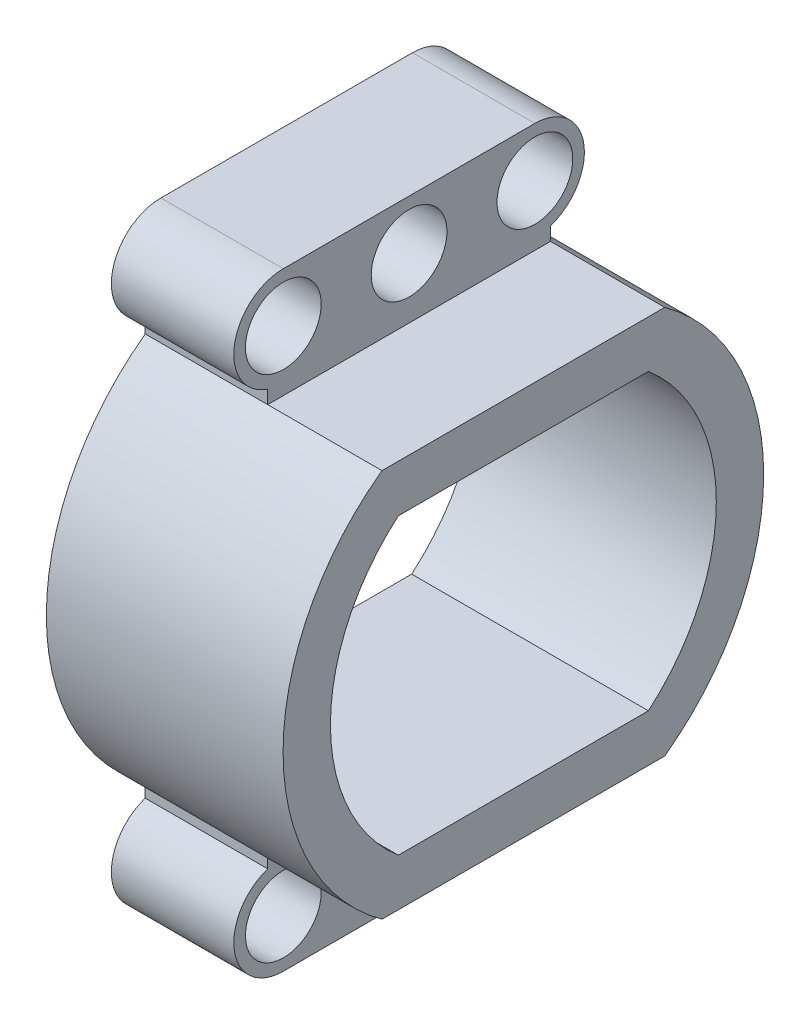
ISO-10303-21;
HEADER;
FILE_DESCRIPTION(('STEP AP214'),'2;1');
FILE_NAME('part.step','',(''),(''),'','','');
FILE_SCHEMA(('AUTOMOTIVE_DESIGN { 1 0 10303 214 1 1 1 1 }'));
ENDSEC;
DATA;
#1=APPLICATION_CONTEXT('core data for automotive mechanical design processes');
#2=APPLICATION_PROTOCOL_DEFINITION('international standard','automotive_design',2000,#1);
#3=PRODUCT_CONTEXT('',#1,'mechanical');
#4=PRODUCT('Part','Part','',(#3));
#5=PRODUCT_RELATED_PRODUCT_CATEGORY('part','',(#4));
#6=PRODUCT_DEFINITION_FORMATION('','',#4);
#7=PRODUCT_DEFINITION_CONTEXT('part definition',#1,'design');
#8=PRODUCT_DEFINITION('design','',#6,#7);
#9=PRODUCT_DEFINITION_SHAPE('','',#8);
#10=(LENGTH_UNIT() NAMED_UNIT(*) SI_UNIT(.MILLI.,.METRE.));
#11=(NAMED_UNIT(*) PLANE_ANGLE_UNIT() SI_UNIT($,.RADIAN.));
#12=(NAMED_UNIT(*) SI_UNIT($,.STERADIAN.) SOLID_ANGLE_UNIT());
#13=UNCERTAINTY_MEASURE_WITH_UNIT(LENGTH_MEASURE(1.E-05),#10,'distance_accuracy_value','');
#14=(GEOMETRIC_REPRESENTATION_CONTEXT(3) GLOBAL_UNCERTAINTY_ASSIGNED_CONTEXT((#13)) GLOBAL_UNIT_ASSIGNED_CONTEXT((#10,
#11,#12)) REPRESENTATION_CONTEXT('',''));
#15=CARTESIAN_POINT('',(0.,0.,0.));
#16=DIRECTION('',(0.,0.,1.));
#17=DIRECTION('',(1.,0.,0.));
#18=AXIS2_PLACEMENT_3D('',#15,#16,#17);
#19=CARTESIAN_POINT('',(15.,0.,0.));
#20=DIRECTION('',(1.,0.,0.));
#21=DIRECTION('',(0.,0.,-1.));
#22=AXIS2_PLACEMENT_3D('',#19,#20,#21);
#23=PLANE('',#22);
#24=CARTESIAN_POINT('',(15.,0.,0.));
#25=DIRECTION('',(1.,0.,0.));
#26=DIRECTION('',(0.,0.,-1.));
#27=AXIS2_PLACEMENT_3D('',#24,#25,#26);
#28=CIRCLE('',#27,15.225);
#29=CARTESIAN_POINT('',(15.,12.31,8.95904710334756));
#30=VERTEX_POINT('',#29);
#31=CARTESIAN_POINT('',(15.,-12.31,8.95904710334756));
#32=VERTEX_POINT('',#31);
#33=EDGE_CURVE('E197',#30,#32,#28,.T.);
#34=ORIENTED_EDGE('',*,*,#33,.T.);
#35=DIRECTION('',(0.,0.,-1.));
#36=VECTOR('',#35,1.);
#37=CARTESIAN_POINT('',(15.,-12.31,8.95904710334756));
#38=LINE('',#37,#36);
#39=CARTESIAN_POINT('',(15.,-12.31,-8.95904710334756));
#40=VERTEX_POINT('',#39);
#41=EDGE_CURVE('E223',#32,#40,#38,.T.);
#42=ORIENTED_EDGE('',*,*,#41,.T.);
#43=CARTESIAN_POINT('',(15.,0.,0.));
#44=DIRECTION('',(1.,0.,0.));
#45=DIRECTION('',(0.,0.,-1.));
#46=AXIS2_PLACEMENT_3D('',#43,#44,#45);
#47=CIRCLE('',#46,15.225);
#48=CARTESIAN_POINT('',(15.,12.31,-8.95904710334756));
#49=VERTEX_POINT('',#48);
#50=EDGE_CURVE('E219',#40,#49,#47,.T.);
#51=ORIENTED_EDGE('',*,*,#50,.T.);
#52=DIRECTION('',(0.,0.,1.));
#53=VECTOR('',#52,1.);
#54=CARTESIAN_POINT('',(15.,12.31,8.95904710334756));
#55=LINE('',#54,#53);
#56=EDGE_CURVE('E203',#49,#30,#55,.T.);
#57=ORIENTED_EDGE('',*,*,#56,.T.);
#58=EDGE_LOOP('',(#34,#42,#51,#57));
#59=FACE_BOUND('',#58,.T.);
#60=DIRECTION('',(0.,0.,-1.));
#61=VECTOR('',#60,1.);
#62=CARTESIAN_POINT('',(15.,-9.31,7.9230376119264));
#63=LINE('',#62,#61);
#64=CARTESIAN_POINT('',(15.,-9.31,7.9230376119264));
#65=VERTEX_POINT('',#64);
#66=CARTESIAN_POINT('',(15.,-9.31,-7.9230376119264));
#67=VERTEX_POINT('',#66);
#68=EDGE_CURVE('E311',#65,#67,#63,.T.);
#69=ORIENTED_EDGE('',*,*,#68,.F.);
#70=CARTESIAN_POINT('',(15.,0.,0.));
#71=DIRECTION('',(1.,0.,0.));
#72=DIRECTION('',(0.,0.,-1.));
#73=AXIS2_PLACEMENT_3D('',#70,#71,#72);
#74=CIRCLE('',#73,12.225);
#75=CARTESIAN_POINT('',(15.,9.31,7.9230376119264));
#76=VERTEX_POINT('',#75);
#77=EDGE_CURVE('E309',#76,#65,#74,.T.);
#78=ORIENTED_EDGE('',*,*,#77,.F.);
#79=DIRECTION('',(0.,0.,1.));
#80=VECTOR('',#79,1.);
#81=CARTESIAN_POINT('',(15.,9.31,7.9230376119264));
#82=LINE('',#81,#80);
#83=CARTESIAN_POINT('',(15.,9.31,-7.9230376119264));
#84=VERTEX_POINT('',#83);
#85=EDGE_CURVE('E317',#84,#76,#82,.T.);
#86=ORIENTED_EDGE('',*,*,#85,.F.);
#87=CARTESIAN_POINT('',(15.,0.,0.));
#88=DIRECTION('',(1.,0.,0.));
#89=DIRECTION('',(0.,0.,-1.));
#90=AXIS2_PLACEMENT_3D('',#87,#88,#89);
#91=CIRCLE('',#90,12.225);
#92=EDGE_CURVE('E314',#67,#84,#91,.T.);
#93=ORIENTED_EDGE('',*,*,#92,.F.);
#94=EDGE_LOOP('',(#69,#78,#86,#93));
#95=FACE_BOUND('',#94,.T.);
#96=ADVANCED_FACE('F39',(#59,#95),#23,.T.);
#97=CARTESIAN_POINT('',(0.,0.,0.));
#98=DIRECTION('',(1.,0.,0.));
#99=DIRECTION('',(0.,0.,-1.));
#100=AXIS2_PLACEMENT_3D('',#97,#98,#99);
#101=PLANE('',#100);
#102=CARTESIAN_POINT('',(0.,0.,0.));
#103=DIRECTION('',(1.,0.,0.));
#104=DIRECTION('',(0.,0.,-1.));
#105=AXIS2_PLACEMENT_3D('',#102,#103,#104);
#106=CIRCLE('',#105,15.225);
#107=CARTESIAN_POINT('',(0.,12.31,8.95904710334756));
#108=VERTEX_POINT('',#107);
#109=CARTESIAN_POINT('',(0.,-12.31,8.95904710334756));
#110=VERTEX_POINT('',#109);
#111=EDGE_CURVE('E184',#108,#110,#106,.T.);
#112=ORIENTED_EDGE('',*,*,#111,.F.);
#113=DIRECTION('',(0.,1.,0.));
#114=VECTOR('',#113,1.);
#115=CARTESIAN_POINT('',(0.,12.31,8.95904710334756));
#116=LINE('',#115,#114);
#117=CARTESIAN_POINT('',(0.,13.1626518307626,8.95904710334756));
#118=VERTEX_POINT('',#117);
#119=EDGE_CURVE('E291',#108,#118,#116,.T.);
#120=ORIENTED_EDGE('',*,*,#119,.T.);
#121=CARTESIAN_POINT('',(0.,16.14,7.97));
#122=DIRECTION('',(-1.,0.,0.));
#123=DIRECTION('',(0.,0.,1.));
#124=AXIS2_PLACEMENT_3D('',#121,#122,#123);
#125=CIRCLE('',#124,3.13732629694487);
#126=CARTESIAN_POINT('',(0.,19.2773262969449,7.97));
#127=VERTEX_POINT('',#126);
#128=EDGE_CURVE('E293',#118,#127,#125,.T.);
#129=ORIENTED_EDGE('',*,*,#128,.T.);
#130=DIRECTION('',(0.,0.,-1.));
#131=VECTOR('',#130,1.);
#132=CARTESIAN_POINT('',(0.,19.2773262969449,-7.97));
#133=LINE('',#132,#131);
#134=CARTESIAN_POINT('',(0.,19.2773262969449,-7.97));
#135=VERTEX_POINT('',#134);
#136=EDGE_CURVE('E272',#127,#135,#133,.T.);
#137=ORIENTED_EDGE('',*,*,#136,.T.);
#138=CARTESIAN_POINT('',(0.,16.14,-7.97));
#139=DIRECTION('',(-1.,0.,0.));
#140=DIRECTION('',(0.,0.,1.));
#141=AXIS2_PLACEMENT_3D('',#138,#139,#140);
#142=CIRCLE('',#141,3.13732629694487);
#143=CARTESIAN_POINT('',(0.,13.1626518307626,-8.95904710334756));
#144=VERTEX_POINT('',#143);
#145=EDGE_CURVE('E265',#135,#144,#142,.T.);
#146=ORIENTED_EDGE('',*,*,#145,.T.);
#147=DIRECTION('',(0.,-1.,0.));
#148=VECTOR('',#147,1.);
#149=CARTESIAN_POINT('',(0.,12.31,-8.95904710334756));
#150=LINE('',#149,#148);
#151=CARTESIAN_POINT('',(0.,12.31,-8.95904710334756));
#152=VERTEX_POINT('',#151);
#153=EDGE_CURVE('E288',#144,#152,#150,.T.);
#154=ORIENTED_EDGE('',*,*,#153,.T.);
#155=CARTESIAN_POINT('',(0.,0.,0.));
#156=DIRECTION('',(1.,0.,0.));
#157=DIRECTION('',(0.,0.,-1.));
#158=AXIS2_PLACEMENT_3D('',#155,#156,#157);
#159=CIRCLE('',#158,15.225);
#160=CARTESIAN_POINT('',(0.,-12.31,-8.95904710334756));
#161=VERTEX_POINT('',#160);
#162=EDGE_CURVE('E193',#161,#152,#159,.T.);
#163=ORIENTED_EDGE('',*,*,#162,.F.);
#164=DIRECTION('',(0.,-1.,0.));
#165=VECTOR('',#164,1.);
#166=CARTESIAN_POINT('',(0.,-12.31,-8.95904710334756));
#167=LINE('',#166,#165);
#168=CARTESIAN_POINT('',(0.,-13.1626518307625,-8.95904710334756));
#169=VERTEX_POINT('',#168);
#170=EDGE_CURVE('E237',#161,#169,#167,.T.);
#171=ORIENTED_EDGE('',*,*,#170,.T.);
#172=CARTESIAN_POINT('',(0.,-16.14,-7.97));
#173=DIRECTION('',(-1.,0.,0.));
#174=DIRECTION('',(0.,0.,-1.));
#175=AXIS2_PLACEMENT_3D('',#172,#173,#174);
#176=CIRCLE('',#175,3.13732629694487);
#177=CARTESIAN_POINT('',(0.,-19.2773262969449,-7.97));
#178=VERTEX_POINT('',#177);
#179=EDGE_CURVE('E634',#169,#178,#176,.T.);
#180=ORIENTED_EDGE('',*,*,#179,.T.);
#181=DIRECTION('',(0.,0.,1.));
#182=VECTOR('',#181,1.);
#183=CARTESIAN_POINT('',(0.,-19.2773262969449,-7.97));
#184=LINE('',#183,#182);
#185=CARTESIAN_POINT('',(0.,-19.2773262969449,7.97));
#186=VERTEX_POINT('',#185);
#187=EDGE_CURVE('E636',#178,#186,#184,.T.);
#188=ORIENTED_EDGE('',*,*,#187,.T.);
#189=CARTESIAN_POINT('',(0.,-16.14,7.97));
#190=DIRECTION('',(-1.,0.,0.));
#191=DIRECTION('',(0.,0.,-1.));
#192=AXIS2_PLACEMENT_3D('',#189,#190,#191);
#193=CIRCLE('',#192,3.13732629694487);
#194=CARTESIAN_POINT('',(0.,-13.1626518307626,8.95904710334756));
#195=VERTEX_POINT('',#194);
#196=EDGE_CURVE('E187',#186,#195,#193,.T.);
#197=ORIENTED_EDGE('',*,*,#196,.T.);
#198=DIRECTION('',(0.,1.,0.));
#199=VECTOR('',#198,1.);
#200=CARTESIAN_POINT('',(0.,-12.31,8.95904710334756));
#201=LINE('',#200,#199);
#202=EDGE_CURVE('E170',#195,#110,#201,.T.);
#203=ORIENTED_EDGE('',*,*,#202,.T.);
#204=EDGE_LOOP('',(#112,#120,#129,#137,#146,#154,#163,#171,#180,#188,#197,#203));
#205=FACE_BOUND('',#204,.T.);
#206=CARTESIAN_POINT('',(0.,0.,0.));
#207=DIRECTION('',(1.,0.,0.));
#208=DIRECTION('',(0.,0.,-1.));
#209=AXIS2_PLACEMENT_3D('',#206,#207,#208);
#210=CIRCLE('',#209,12.225);
#211=CARTESIAN_POINT('',(0.,9.31,7.9230376119264));
#212=VERTEX_POINT('',#211);
#213=CARTESIAN_POINT('',(0.,-9.31,7.9230376119264));
#214=VERTEX_POINT('',#213);
#215=EDGE_CURVE('E300',#212,#214,#210,.T.);
#216=ORIENTED_EDGE('',*,*,#215,.T.);
#217=DIRECTION('',(0.,0.,-1.));
#218=VECTOR('',#217,1.);
#219=CARTESIAN_POINT('',(0.,-9.31,7.9230376119264));
#220=LINE('',#219,#218);
#221=CARTESIAN_POINT('',(0.,-9.31,-7.9230376119264));
#222=VERTEX_POINT('',#221);
#223=EDGE_CURVE('E322',#214,#222,#220,.T.);
#224=ORIENTED_EDGE('',*,*,#223,.T.);
#225=CARTESIAN_POINT('',(0.,0.,0.));
#226=DIRECTION('',(1.,0.,0.));
#227=DIRECTION('',(0.,0.,-1.));
#228=AXIS2_PLACEMENT_3D('',#225,#226,#227);
#229=CIRCLE('',#228,12.225);
#230=CARTESIAN_POINT('',(0.,9.31,-7.9230376119264));
#231=VERTEX_POINT('',#230);
#232=EDGE_CURVE('E325',#222,#231,#229,.T.);
#233=ORIENTED_EDGE('',*,*,#232,.T.);
#234=DIRECTION('',(0.,0.,1.));
#235=VECTOR('',#234,1.);
#236=CARTESIAN_POINT('',(0.,9.31,7.9230376119264));
#237=LINE('',#236,#235);
#238=EDGE_CURVE('E312',#231,#212,#237,.T.);
#239=ORIENTED_EDGE('',*,*,#238,.T.);
#240=EDGE_LOOP('',(#216,#224,#233,#239));
#241=FACE_BOUND('',#240,.T.);
#242=CARTESIAN_POINT('',(0.,16.14,7.97));
#243=DIRECTION('',(-1.,0.,0.));
#244=DIRECTION('',(0.,0.,1.));
#245=AXIS2_PLACEMENT_3D('',#242,#243,#244);
#246=CIRCLE('',#245,2.4);
#247=CARTESIAN_POINT('',(0.,16.14,10.37));
#248=VERTEX_POINT('',#247);
#249=EDGE_CURVE('E247',#248,#248,#246,.T.);
#250=ORIENTED_EDGE('',*,*,#249,.F.);
#251=EDGE_LOOP('',(#250));
#252=FACE_BOUND('',#251,.T.);
#253=CARTESIAN_POINT('',(0.,16.14,0.));
#254=DIRECTION('',(-1.,0.,0.));
#255=DIRECTION('',(0.,0.,1.));
#256=AXIS2_PLACEMENT_3D('',#253,#254,#255);
#257=CIRCLE('',#256,2.4);
#258=CARTESIAN_POINT('',(0.,16.14,2.4));
#259=VERTEX_POINT('',#258);
#260=EDGE_CURVE('E253',#259,#259,#257,.T.);
#261=ORIENTED_EDGE('',*,*,#260,.F.);
#262=EDGE_LOOP('',(#261));
#263=FACE_BOUND('',#262,.T.);
#264=CARTESIAN_POINT('',(0.,16.14,-7.97));
#265=DIRECTION('',(-1.,0.,0.));
#266=DIRECTION('',(0.,0.,1.));
#267=AXIS2_PLACEMENT_3D('',#264,#265,#266);
#268=CIRCLE('',#267,2.4);
#269=CARTESIAN_POINT('',(0.,16.14,-5.57));
#270=VERTEX_POINT('',#269);
#271=EDGE_CURVE('E259',#270,#270,#268,.T.);
#272=ORIENTED_EDGE('',*,*,#271,.F.);
#273=EDGE_LOOP('',(#272));
#274=FACE_BOUND('',#273,.T.);
#275=CARTESIAN_POINT('',(0.,-16.14,-7.97));
#276=DIRECTION('',(-1.,0.,0.));
#277=DIRECTION('',(0.,0.,-1.));
#278=AXIS2_PLACEMENT_3D('',#275,#276,#277);
#279=CIRCLE('',#278,2.4);
#280=CARTESIAN_POINT('',(0.,-16.14,-10.37));
#281=VERTEX_POINT('',#280);
#282=EDGE_CURVE('E244',#281,#281,#279,.T.);
#283=ORIENTED_EDGE('',*,*,#282,.F.);
#284=EDGE_LOOP('',(#283));
#285=FACE_BOUND('',#284,.T.);
#286=CARTESIAN_POINT('',(0.,-16.14,0.));
#287=DIRECTION('',(-1.,0.,0.));
#288=DIRECTION('',(0.,0.,-1.));
#289=AXIS2_PLACEMENT_3D('',#286,#287,#288);
#290=CIRCLE('',#289,2.4);
#291=CARTESIAN_POINT('',(0.,-16.14,-2.4));
#292=VERTEX_POINT('',#291);
#293=EDGE_CURVE('E238',#292,#292,#290,.T.);
#294=ORIENTED_EDGE('',*,*,#293,.F.);
#295=EDGE_LOOP('',(#294));
#296=FACE_BOUND('',#295,.T.);
#297=CARTESIAN_POINT('',(0.,-16.14,7.97));
#298=DIRECTION('',(-1.,0.,0.));
#299=DIRECTION('',(0.,0.,-1.));
#300=AXIS2_PLACEMENT_3D('',#297,#298,#299);
#301=CIRCLE('',#300,2.4);
#302=CARTESIAN_POINT('',(0.,-16.14,5.57));
#303=VERTEX_POINT('',#302);
#304=EDGE_CURVE('E230',#303,#303,#301,.T.);
#305=ORIENTED_EDGE('',*,*,#304,.F.);
#306=EDGE_LOOP('',(#305));
#307=FACE_BOUND('',#306,.T.);
#308=ADVANCED_FACE('F181',(#205,#241,#252,#263,#274,#285,#296,#307),#101,.F.);
#309=CARTESIAN_POINT('',(15.,0.,0.));
#310=DIRECTION('',(-1.,0.,0.));
#311=DIRECTION('',(0.,0.,1.));
#312=AXIS2_PLACEMENT_3D('',#309,#310,#311);
#313=CYLINDRICAL_SURFACE('',#312,15.225);
#314=ORIENTED_EDGE('',*,*,#111,.T.);
#315=DIRECTION('',(-1.,0.,0.));
#316=VECTOR('',#315,1.);
#317=CARTESIAN_POINT('',(7.76,-12.31,8.95904710334756));
#318=LINE('',#317,#316);
#319=CARTESIAN_POINT('',(7.76,-12.31,8.95904710334756));
#320=VERTEX_POINT('',#319);
#321=EDGE_CURVE('E167',#320,#110,#318,.T.);
#322=ORIENTED_EDGE('',*,*,#321,.F.);
#323=DIRECTION('',(-1.,0.,0.));
#324=VECTOR('',#323,1.);
#325=CARTESIAN_POINT('',(15.,-12.31,8.95904710334756));
#326=LINE('',#325,#324);
#327=EDGE_CURVE('E11',#32,#320,#326,.T.);
#328=ORIENTED_EDGE('',*,*,#327,.F.);
#329=ORIENTED_EDGE('',*,*,#33,.F.);
#330=DIRECTION('',(-1.,0.,0.));
#331=VECTOR('',#330,1.);
#332=CARTESIAN_POINT('',(15.,12.31,8.95904710334756));
#333=LINE('',#332,#331);
#334=CARTESIAN_POINT('',(7.76,12.31,8.95904710334756));
#335=VERTEX_POINT('',#334);
#336=EDGE_CURVE('E206',#30,#335,#333,.T.);
#337=ORIENTED_EDGE('',*,*,#336,.T.);
#338=DIRECTION('',(-1.,0.,0.));
#339=VECTOR('',#338,1.);
#340=CARTESIAN_POINT('',(7.76,12.31,8.95904710334756));
#341=LINE('',#340,#339);
#342=EDGE_CURVE('E192',#335,#108,#341,.T.);
#343=ORIENTED_EDGE('',*,*,#342,.T.);
#344=EDGE_LOOP('',(#314,#322,#328,#329,#337,#343));
#345=FACE_BOUND('',#344,.T.);
#346=ADVANCED_FACE('F41',(#345),#313,.T.);
#347=CARTESIAN_POINT('',(15.,-12.31,8.95904710334756));
#348=DIRECTION('',(0.,1.,0.));
#349=DIRECTION('',(0.,0.,1.));
#350=AXIS2_PLACEMENT_3D('',#347,#348,#349);
#351=PLANE('',#350);
#352=ORIENTED_EDGE('',*,*,#327,.T.);
#353=DIRECTION('',(0.,0.,-1.));
#354=VECTOR('',#353,1.);
#355=CARTESIAN_POINT('',(7.76,-12.31,-8.95904710334756));
#356=LINE('',#355,#354);
#357=CARTESIAN_POINT('',(7.76,-12.31,-8.95904710334756));
#358=VERTEX_POINT('',#357);
#359=EDGE_CURVE('E188',#320,#358,#356,.T.);
#360=ORIENTED_EDGE('',*,*,#359,.T.);
#361=DIRECTION('',(-1.,0.,0.));
#362=VECTOR('',#361,1.);
#363=CARTESIAN_POINT('',(15.,-12.31,-8.95904710334756));
#364=LINE('',#363,#362);
#365=EDGE_CURVE('E47',#40,#358,#364,.T.);
#366=ORIENTED_EDGE('',*,*,#365,.F.);
#367=ORIENTED_EDGE('',*,*,#41,.F.);
#368=EDGE_LOOP('',(#352,#360,#366,#367));
#369=FACE_BOUND('',#368,.T.);
#370=ADVANCED_FACE('F222',(#369),#351,.F.);
#371=CARTESIAN_POINT('',(15.,0.,0.));
#372=DIRECTION('',(-1.,0.,0.));
#373=DIRECTION('',(0.,0.,1.));
#374=AXIS2_PLACEMENT_3D('',#371,#372,#373);
#375=CYLINDRICAL_SURFACE('',#374,15.225);
#376=ORIENTED_EDGE('',*,*,#162,.T.);
#377=DIRECTION('',(-1.,0.,0.));
#378=VECTOR('',#377,1.);
#379=CARTESIAN_POINT('',(7.76,12.31,-8.95904710334756));
#380=LINE('',#379,#378);
#381=CARTESIAN_POINT('',(7.76,12.31,-8.95904710334756));
#382=VERTEX_POINT('',#381);
#383=EDGE_CURVE('E306',#382,#152,#380,.T.);
#384=ORIENTED_EDGE('',*,*,#383,.F.);
#385=DIRECTION('',(-1.,0.,0.));
#386=VECTOR('',#385,1.);
#387=CARTESIAN_POINT('',(15.,12.31,-8.95904710334756));
#388=LINE('',#387,#386);
#389=EDGE_CURVE('E208',#49,#382,#388,.T.);
#390=ORIENTED_EDGE('',*,*,#389,.F.);
#391=ORIENTED_EDGE('',*,*,#50,.F.);
#392=ORIENTED_EDGE('',*,*,#365,.T.);
#393=DIRECTION('',(-1.,0.,0.));
#394=VECTOR('',#393,1.);
#395=CARTESIAN_POINT('',(7.76,-12.31,-8.95904710334756));
#396=LINE('',#395,#394);
#397=EDGE_CURVE('E216',#358,#161,#396,.T.);
#398=ORIENTED_EDGE('',*,*,#397,.T.);
#399=EDGE_LOOP('',(#376,#384,#390,#391,#392,#398));
#400=FACE_BOUND('',#399,.T.);
#401=ADVANCED_FACE('F215',(#400),#375,.T.);
#402=CARTESIAN_POINT('',(15.,12.31,8.95904710334756));
#403=DIRECTION('',(0.,-1.,0.));
#404=DIRECTION('',(0.,0.,-1.));
#405=AXIS2_PLACEMENT_3D('',#402,#403,#404);
#406=PLANE('',#405);
#407=ORIENTED_EDGE('',*,*,#389,.T.);
#408=DIRECTION('',(0.,0.,1.));
#409=VECTOR('',#408,1.);
#410=CARTESIAN_POINT('',(7.76,12.31,-8.95904710334756));
#411=LINE('',#410,#409);
#412=EDGE_CURVE('E275',#382,#335,#411,.T.);
#413=ORIENTED_EDGE('',*,*,#412,.T.);
#414=ORIENTED_EDGE('',*,*,#336,.F.);
#415=ORIENTED_EDGE('',*,*,#56,.F.);
#416=EDGE_LOOP('',(#407,#413,#414,#415));
#417=FACE_BOUND('',#416,.T.);
#418=ADVANCED_FACE('F342',(#417),#406,.F.);
#419=CARTESIAN_POINT('',(15.,0.,0.));
#420=DIRECTION('',(-1.,0.,0.));
#421=DIRECTION('',(0.,0.,1.));
#422=AXIS2_PLACEMENT_3D('',#419,#420,#421);
#423=CYLINDRICAL_SURFACE('',#422,12.225);
#424=ORIENTED_EDGE('',*,*,#215,.F.);
#425=DIRECTION('',(-1.,0.,0.));
#426=VECTOR('',#425,1.);
#427=CARTESIAN_POINT('',(15.,9.31,7.9230376119264));
#428=LINE('',#427,#426);
#429=EDGE_CURVE('E319',#76,#212,#428,.T.);
#430=ORIENTED_EDGE('',*,*,#429,.F.);
#431=ORIENTED_EDGE('',*,*,#77,.T.);
#432=DIRECTION('',(-1.,0.,0.));
#433=VECTOR('',#432,1.);
#434=CARTESIAN_POINT('',(15.,-9.31,7.9230376119264));
#435=LINE('',#434,#433);
#436=EDGE_CURVE('E194',#65,#214,#435,.T.);
#437=ORIENTED_EDGE('',*,*,#436,.T.);
#438=EDGE_LOOP('',(#424,#430,#431,#437));
#439=FACE_BOUND('',#438,.T.);
#440=ADVANCED_FACE('F380',(#439),#423,.F.);
#441=CARTESIAN_POINT('',(15.,-9.31,7.9230376119264));
#442=DIRECTION('',(0.,1.,0.));
#443=DIRECTION('',(0.,0.,1.));
#444=AXIS2_PLACEMENT_3D('',#441,#442,#443);
#445=PLANE('',#444);
#446=ORIENTED_EDGE('',*,*,#223,.F.);
#447=ORIENTED_EDGE('',*,*,#436,.F.);
#448=ORIENTED_EDGE('',*,*,#68,.T.);
#449=DIRECTION('',(-1.,0.,0.));
#450=VECTOR('',#449,1.);
#451=CARTESIAN_POINT('',(15.,-9.31,-7.9230376119264));
#452=LINE('',#451,#450);
#453=EDGE_CURVE('E200',#67,#222,#452,.T.);
#454=ORIENTED_EDGE('',*,*,#453,.T.);
#455=EDGE_LOOP('',(#446,#447,#448,#454));
#456=FACE_BOUND('',#455,.T.);
#457=ADVANCED_FACE('F416',(#456),#445,.T.);
#458=CARTESIAN_POINT('',(15.,0.,0.));
#459=DIRECTION('',(-1.,0.,0.));
#460=DIRECTION('',(0.,0.,1.));
#461=AXIS2_PLACEMENT_3D('',#458,#459,#460);
#462=CYLINDRICAL_SURFACE('',#461,12.225);
#463=ORIENTED_EDGE('',*,*,#232,.F.);
#464=ORIENTED_EDGE('',*,*,#453,.F.);
#465=ORIENTED_EDGE('',*,*,#92,.T.);
#466=DIRECTION('',(-1.,0.,0.));
#467=VECTOR('',#466,1.);
#468=CARTESIAN_POINT('',(15.,9.31,-7.9230376119264));
#469=LINE('',#468,#467);
#470=EDGE_CURVE('E332',#84,#231,#469,.T.);
#471=ORIENTED_EDGE('',*,*,#470,.T.);
#472=EDGE_LOOP('',(#463,#464,#465,#471));
#473=FACE_BOUND('',#472,.T.);
#474=ADVANCED_FACE('F407',(#473),#462,.F.);
#475=CARTESIAN_POINT('',(15.,9.31,7.9230376119264));
#476=DIRECTION('',(0.,-1.,0.));
#477=DIRECTION('',(0.,0.,-1.));
#478=AXIS2_PLACEMENT_3D('',#475,#476,#477);
#479=PLANE('',#478);
#480=ORIENTED_EDGE('',*,*,#238,.F.);
#481=ORIENTED_EDGE('',*,*,#470,.F.);
#482=ORIENTED_EDGE('',*,*,#85,.T.);
#483=ORIENTED_EDGE('',*,*,#429,.T.);
#484=EDGE_LOOP('',(#480,#481,#482,#483));
#485=FACE_BOUND('',#484,.T.);
#486=ADVANCED_FACE('F403',(#485),#479,.T.);
#487=CARTESIAN_POINT('',(7.76,16.14,-7.97));
#488=DIRECTION('',(-1.,0.,0.));
#489=DIRECTION('',(0.,0.,1.));
#490=AXIS2_PLACEMENT_3D('',#487,#488,#489);
#491=CYLINDRICAL_SURFACE('',#490,3.13732629694487);
#492=ORIENTED_EDGE('',*,*,#145,.F.);
#493=DIRECTION('',(-1.,0.,0.));
#494=VECTOR('',#493,1.);
#495=CARTESIAN_POINT('',(7.76,19.2773262969449,-7.97));
#496=LINE('',#495,#494);
#497=CARTESIAN_POINT('',(7.76,19.2773262969449,-7.97));
#498=VERTEX_POINT('',#497);
#499=EDGE_CURVE('E298',#498,#135,#496,.T.);
#500=ORIENTED_EDGE('',*,*,#499,.F.);
#501=CARTESIAN_POINT('',(7.76,16.14,-7.97));
#502=DIRECTION('',(-1.,0.,0.));
#503=DIRECTION('',(0.,0.,1.));
#504=AXIS2_PLACEMENT_3D('',#501,#502,#503);
#505=CIRCLE('',#504,3.13732629694487);
#506=CARTESIAN_POINT('',(7.76,13.1626518307626,-8.95904710334756));
#507=VERTEX_POINT('',#506);
#508=EDGE_CURVE('E268',#498,#507,#505,.T.);
#509=ORIENTED_EDGE('',*,*,#508,.T.);
#510=DIRECTION('',(-1.,0.,0.));
#511=VECTOR('',#510,1.);
#512=CARTESIAN_POINT('',(7.76,13.1626518307626,-8.95904710334756));
#513=LINE('',#512,#511);
#514=EDGE_CURVE('E285',#507,#144,#513,.T.);
#515=ORIENTED_EDGE('',*,*,#514,.T.);
#516=EDGE_LOOP('',(#492,#500,#509,#515));
#517=FACE_BOUND('',#516,.T.);
#518=ADVANCED_FACE('F355',(#517),#491,.T.);
#519=CARTESIAN_POINT('',(7.76,19.2773262969449,-7.97));
#520=DIRECTION('',(0.,1.,0.));
#521=DIRECTION('',(0.,0.,1.));
#522=AXIS2_PLACEMENT_3D('',#519,#520,#521);
#523=PLANE('',#522);
#524=ORIENTED_EDGE('',*,*,#136,.F.);
#525=DIRECTION('',(-1.,0.,0.));
#526=VECTOR('',#525,1.);
#527=CARTESIAN_POINT('',(7.76,19.2773262969449,7.97));
#528=LINE('',#527,#526);
#529=CARTESIAN_POINT('',(7.76,19.2773262969449,7.97));
#530=VERTEX_POINT('',#529);
#531=EDGE_CURVE('E301',#530,#127,#528,.T.);
#532=ORIENTED_EDGE('',*,*,#531,.F.);
#533=DIRECTION('',(0.,0.,-1.));
#534=VECTOR('',#533,1.);
#535=CARTESIAN_POINT('',(7.76,19.2773262969449,-7.97));
#536=LINE('',#535,#534);
#537=EDGE_CURVE('E282',#530,#498,#536,.T.);
#538=ORIENTED_EDGE('',*,*,#537,.T.);
#539=ORIENTED_EDGE('',*,*,#499,.T.);
#540=EDGE_LOOP('',(#524,#532,#538,#539));
#541=FACE_BOUND('',#540,.T.);
#542=ADVANCED_FACE('F358',(#541),#523,.T.);
#543=CARTESIAN_POINT('',(7.76,16.14,7.97));
#544=DIRECTION('',(-1.,0.,0.));
#545=DIRECTION('',(0.,0.,1.));
#546=AXIS2_PLACEMENT_3D('',#543,#544,#545);
#547=CYLINDRICAL_SURFACE('',#546,3.13732629694487);
#548=ORIENTED_EDGE('',*,*,#128,.F.);
#549=DIRECTION('',(-1.,0.,0.));
#550=VECTOR('',#549,1.);
#551=CARTESIAN_POINT('',(7.76,13.1626518307626,8.95904710334756));
#552=LINE('',#551,#550);
#553=CARTESIAN_POINT('',(7.76,13.1626518307626,8.95904710334756));
#554=VERTEX_POINT('',#553);
#555=EDGE_CURVE('E303',#554,#118,#552,.T.);
#556=ORIENTED_EDGE('',*,*,#555,.F.);
#557=CARTESIAN_POINT('',(7.76,16.14,7.97));
#558=DIRECTION('',(-1.,0.,0.));
#559=DIRECTION('',(0.,0.,1.));
#560=AXIS2_PLACEMENT_3D('',#557,#558,#559);
#561=CIRCLE('',#560,3.13732629694487);
#562=EDGE_CURVE('E279',#554,#530,#561,.T.);
#563=ORIENTED_EDGE('',*,*,#562,.T.);
#564=ORIENTED_EDGE('',*,*,#531,.T.);
#565=EDGE_LOOP('',(#548,#556,#563,#564));
#566=FACE_BOUND('',#565,.T.);
#567=ADVANCED_FACE('F361',(#566),#547,.T.);
#568=CARTESIAN_POINT('',(7.76,12.31,8.95904710334756));
#569=DIRECTION('',(0.,0.,1.));
#570=DIRECTION('',(1.,0.,0.));
#571=AXIS2_PLACEMENT_3D('',#568,#569,#570);
#572=PLANE('',#571);
#573=ORIENTED_EDGE('',*,*,#119,.F.);
#574=ORIENTED_EDGE('',*,*,#342,.F.);
#575=DIRECTION('',(0.,1.,0.));
#576=VECTOR('',#575,1.);
#577=CARTESIAN_POINT('',(7.76,12.31,8.95904710334756));
#578=LINE('',#577,#576);
#579=EDGE_CURVE('E62',#335,#554,#578,.T.);
#580=ORIENTED_EDGE('',*,*,#579,.T.);
#581=ORIENTED_EDGE('',*,*,#555,.T.);
#582=EDGE_LOOP('',(#573,#574,#580,#581));
#583=FACE_BOUND('',#582,.T.);
#584=ADVANCED_FACE('F363',(#583),#572,.T.);
#585=CARTESIAN_POINT('',(7.76,12.31,-8.95904710334756));
#586=DIRECTION('',(0.,0.,-1.));
#587=DIRECTION('',(-1.,0.,0.));
#588=AXIS2_PLACEMENT_3D('',#585,#586,#587);
#589=PLANE('',#588);
#590=ORIENTED_EDGE('',*,*,#153,.F.);
#591=ORIENTED_EDGE('',*,*,#514,.F.);
#592=DIRECTION('',(0.,-1.,0.));
#593=VECTOR('',#592,1.);
#594=CARTESIAN_POINT('',(7.76,12.31,-8.95904710334756));
#595=LINE('',#594,#593);
#596=EDGE_CURVE('E271',#507,#382,#595,.T.);
#597=ORIENTED_EDGE('',*,*,#596,.T.);
#598=ORIENTED_EDGE('',*,*,#383,.T.);
#599=EDGE_LOOP('',(#590,#591,#597,#598));
#600=FACE_BOUND('',#599,.T.);
#601=ADVANCED_FACE('F349',(#600),#589,.T.);
#602=CARTESIAN_POINT('',(7.76,16.14,-7.97));
#603=DIRECTION('',(-1.,0.,0.));
#604=DIRECTION('',(0.,0.,1.));
#605=AXIS2_PLACEMENT_3D('',#602,#603,#604);
#606=PLANE('',#605);
#607=CARTESIAN_POINT('',(7.76,16.14,7.97));
#608=DIRECTION('',(-1.,0.,0.));
#609=DIRECTION('',(0.,0.,1.));
#610=AXIS2_PLACEMENT_3D('',#607,#608,#609);
#611=CIRCLE('',#610,2.4);
#612=CARTESIAN_POINT('',(7.76,16.14,10.37));
#613=VERTEX_POINT('',#612);
#614=EDGE_CURVE('E250',#613,#613,#611,.T.);
#615=ORIENTED_EDGE('',*,*,#614,.T.);
#616=EDGE_LOOP('',(#615));
#617=FACE_BOUND('',#616,.T.);
#618=CARTESIAN_POINT('',(7.76,16.14,0.));
#619=DIRECTION('',(-1.,0.,0.));
#620=DIRECTION('',(0.,0.,1.));
#621=AXIS2_PLACEMENT_3D('',#618,#619,#620);
#622=CIRCLE('',#621,2.4);
#623=CARTESIAN_POINT('',(7.76,16.14,2.4));
#624=VERTEX_POINT('',#623);
#625=EDGE_CURVE('E256',#624,#624,#622,.T.);
#626=ORIENTED_EDGE('',*,*,#625,.T.);
#627=EDGE_LOOP('',(#626));
#628=FACE_BOUND('',#627,.T.);
#629=CARTESIAN_POINT('',(7.76,16.14,-7.97));
#630=DIRECTION('',(-1.,0.,0.));
#631=DIRECTION('',(0.,0.,1.));
#632=AXIS2_PLACEMENT_3D('',#629,#630,#631);
#633=CIRCLE('',#632,2.4);
#634=CARTESIAN_POINT('',(7.76,16.14,-5.57));
#635=VERTEX_POINT('',#634);
#636=EDGE_CURVE('E262',#635,#635,#633,.T.);
#637=ORIENTED_EDGE('',*,*,#636,.T.);
#638=EDGE_LOOP('',(#637));
#639=FACE_BOUND('',#638,.T.);
#640=ORIENTED_EDGE('',*,*,#508,.F.);
#641=ORIENTED_EDGE('',*,*,#537,.F.);
#642=ORIENTED_EDGE('',*,*,#562,.F.);
#643=ORIENTED_EDGE('',*,*,#579,.F.);
#644=ORIENTED_EDGE('',*,*,#412,.F.);
#645=ORIENTED_EDGE('',*,*,#596,.F.);
#646=EDGE_LOOP('',(#640,#641,#642,#643,#644,#645));
#647=FACE_BOUND('',#646,.T.);
#648=ADVANCED_FACE('F345',(#617,#628,#639,#647),#606,.F.);
#649=CARTESIAN_POINT('',(7.76,16.14,-7.97));
#650=DIRECTION('',(-1.,0.,0.));
#651=DIRECTION('',(0.,0.,1.));
#652=AXIS2_PLACEMENT_3D('',#649,#650,#651);
#653=CYLINDRICAL_SURFACE('',#652,2.4);
#654=ORIENTED_EDGE('',*,*,#636,.F.);
#655=EDGE_LOOP('',(#654));
#656=FACE_BOUND('',#655,.T.);
#657=ORIENTED_EDGE('',*,*,#271,.T.);
#658=EDGE_LOOP('',(#657));
#659=FACE_BOUND('',#658,.T.);
#660=ADVANCED_FACE('F497',(#656,#659),#653,.F.);
#661=CARTESIAN_POINT('',(7.76,16.14,0.));
#662=DIRECTION('',(-1.,0.,0.));
#663=DIRECTION('',(0.,0.,1.));
#664=AXIS2_PLACEMENT_3D('',#661,#662,#663);
#665=CYLINDRICAL_SURFACE('',#664,2.4);
#666=ORIENTED_EDGE('',*,*,#625,.F.);
#667=EDGE_LOOP('',(#666));
#668=FACE_BOUND('',#667,.T.);
#669=ORIENTED_EDGE('',*,*,#260,.T.);
#670=EDGE_LOOP('',(#669));
#671=FACE_BOUND('',#670,.T.);
#672=ADVANCED_FACE('F507',(#668,#671),#665,.F.);
#673=CARTESIAN_POINT('',(7.76,16.14,7.97));
#674=DIRECTION('',(-1.,0.,0.));
#675=DIRECTION('',(0.,0.,1.));
#676=AXIS2_PLACEMENT_3D('',#673,#674,#675);
#677=CYLINDRICAL_SURFACE('',#676,2.4);
#678=ORIENTED_EDGE('',*,*,#614,.F.);
#679=EDGE_LOOP('',(#678));
#680=FACE_BOUND('',#679,.T.);
#681=ORIENTED_EDGE('',*,*,#249,.T.);
#682=EDGE_LOOP('',(#681));
#683=FACE_BOUND('',#682,.T.);
#684=ADVANCED_FACE('F517',(#680,#683),#677,.F.);
#685=CARTESIAN_POINT('',(7.76,-12.31,8.95904710334756));
#686=DIRECTION('',(0.,0.,1.));
#687=DIRECTION('',(1.,0.,0.));
#688=AXIS2_PLACEMENT_3D('',#685,#686,#687);
#689=PLANE('',#688);
#690=ORIENTED_EDGE('',*,*,#202,.F.);
#691=DIRECTION('',(-1.,0.,0.));
#692=VECTOR('',#691,1.);
#693=CARTESIAN_POINT('',(7.76,-13.1626518307626,8.95904710334756));
#694=LINE('',#693,#692);
#695=CARTESIAN_POINT('',(7.76,-13.1626518307626,8.95904710334756));
#696=VERTEX_POINT('',#695);
#697=EDGE_CURVE('E176',#696,#195,#694,.T.);
#698=ORIENTED_EDGE('',*,*,#697,.F.);
#699=DIRECTION('',(0.,1.,0.));
#700=VECTOR('',#699,1.);
#701=CARTESIAN_POINT('',(7.76,-12.31,8.95904710334756));
#702=LINE('',#701,#700);
#703=EDGE_CURVE('E172',#696,#320,#702,.T.);
#704=ORIENTED_EDGE('',*,*,#703,.T.);
#705=ORIENTED_EDGE('',*,*,#321,.T.);
#706=EDGE_LOOP('',(#690,#698,#704,#705));
#707=FACE_BOUND('',#706,.T.);
#708=ADVANCED_FACE('F169',(#707),#689,.T.);
#709=CARTESIAN_POINT('',(7.76,-16.14,7.97));
#710=DIRECTION('',(-1.,0.,0.));
#711=DIRECTION('',(0.,0.,1.));
#712=AXIS2_PLACEMENT_3D('',#709,#710,#711);
#713=CYLINDRICAL_SURFACE('',#712,3.13732629694487);
#714=ORIENTED_EDGE('',*,*,#196,.F.);
#715=DIRECTION('',(-1.,0.,0.));
#716=VECTOR('',#715,1.);
#717=CARTESIAN_POINT('',(7.76,-19.2773262969449,7.97));
#718=LINE('',#717,#716);
#719=CARTESIAN_POINT('',(7.76,-19.2773262969449,7.97));
#720=VERTEX_POINT('',#719);
#721=EDGE_CURVE('E651',#720,#186,#718,.T.);
#722=ORIENTED_EDGE('',*,*,#721,.F.);
#723=CARTESIAN_POINT('',(7.76,-16.14,7.97));
#724=DIRECTION('',(-1.,0.,0.));
#725=DIRECTION('',(0.,0.,-1.));
#726=AXIS2_PLACEMENT_3D('',#723,#724,#725);
#727=CIRCLE('',#726,3.13732629694487);
#728=EDGE_CURVE('E641',#720,#696,#727,.T.);
#729=ORIENTED_EDGE('',*,*,#728,.T.);
#730=ORIENTED_EDGE('',*,*,#697,.T.);
#731=EDGE_LOOP('',(#714,#722,#729,#730));
#732=FACE_BOUND('',#731,.T.);
#733=ADVANCED_FACE('F536',(#732),#713,.T.);
#734=CARTESIAN_POINT('',(7.76,-19.2773262969449,-7.97));
#735=DIRECTION('',(0.,-1.,0.));
#736=DIRECTION('',(0.,0.,-1.));
#737=AXIS2_PLACEMENT_3D('',#734,#735,#736);
#738=PLANE('',#737);
#739=ORIENTED_EDGE('',*,*,#187,.F.);
#740=DIRECTION('',(-1.,0.,0.));
#741=VECTOR('',#740,1.);
#742=CARTESIAN_POINT('',(7.76,-19.2773262969449,-7.97));
#743=LINE('',#742,#741);
#744=CARTESIAN_POINT('',(7.76,-19.2773262969449,-7.97));
#745=VERTEX_POINT('',#744);
#746=EDGE_CURVE('E647',#745,#178,#743,.T.);
#747=ORIENTED_EDGE('',*,*,#746,.F.);
#748=DIRECTION('',(0.,0.,1.));
#749=VECTOR('',#748,1.);
#750=CARTESIAN_POINT('',(7.76,-19.2773262969449,-7.97));
#751=LINE('',#750,#749);
#752=EDGE_CURVE('E644',#745,#720,#751,.T.);
#753=ORIENTED_EDGE('',*,*,#752,.T.);
#754=ORIENTED_EDGE('',*,*,#721,.T.);
#755=EDGE_LOOP('',(#739,#747,#753,#754));
#756=FACE_BOUND('',#755,.T.);
#757=ADVANCED_FACE('F545',(#756),#738,.T.);
#758=CARTESIAN_POINT('',(7.76,-16.14,-7.97));
#759=DIRECTION('',(-1.,0.,0.));
#760=DIRECTION('',(0.,0.,1.));
#761=AXIS2_PLACEMENT_3D('',#758,#759,#760);
#762=CYLINDRICAL_SURFACE('',#761,3.13732629694487);
#763=ORIENTED_EDGE('',*,*,#179,.F.);
#764=DIRECTION('',(-1.,0.,0.));
#765=VECTOR('',#764,1.);
#766=CARTESIAN_POINT('',(7.76,-13.1626518307625,-8.95904710334756));
#767=LINE('',#766,#765);
#768=CARTESIAN_POINT('',(7.76,-13.1626518307625,-8.95904710334756));
#769=VERTEX_POINT('',#768);
#770=EDGE_CURVE('E632',#769,#169,#767,.T.);
#771=ORIENTED_EDGE('',*,*,#770,.F.);
#772=CARTESIAN_POINT('',(7.76,-16.14,-7.97));
#773=DIRECTION('',(-1.,0.,0.));
#774=DIRECTION('',(0.,0.,-1.));
#775=AXIS2_PLACEMENT_3D('',#772,#773,#774);
#776=CIRCLE('',#775,3.13732629694487);
#777=EDGE_CURVE('E226',#769,#745,#776,.T.);
#778=ORIENTED_EDGE('',*,*,#777,.T.);
#779=ORIENTED_EDGE('',*,*,#746,.T.);
#780=EDGE_LOOP('',(#763,#771,#778,#779));
#781=FACE_BOUND('',#780,.T.);
#782=ADVANCED_FACE('F555',(#781),#762,.T.);
#783=CARTESIAN_POINT('',(7.76,-12.31,-8.95904710334756));
#784=DIRECTION('',(0.,0.,-1.));
#785=DIRECTION('',(-1.,0.,0.));
#786=AXIS2_PLACEMENT_3D('',#783,#784,#785);
#787=PLANE('',#786);
#788=ORIENTED_EDGE('',*,*,#170,.F.);
#789=ORIENTED_EDGE('',*,*,#397,.F.);
#790=DIRECTION('',(0.,-1.,0.));
#791=VECTOR('',#790,1.);
#792=CARTESIAN_POINT('',(7.76,-12.31,-8.95904710334756));
#793=LINE('',#792,#791);
#794=EDGE_CURVE('E54',#358,#769,#793,.T.);
#795=ORIENTED_EDGE('',*,*,#794,.T.);
#796=ORIENTED_EDGE('',*,*,#770,.T.);
#797=EDGE_LOOP('',(#788,#789,#795,#796));
#798=FACE_BOUND('',#797,.T.);
#799=ADVANCED_FACE('F565',(#798),#787,.T.);
#800=CARTESIAN_POINT('',(7.76,-16.14,7.97));
#801=DIRECTION('',(1.,0.,0.));
#802=DIRECTION('',(0.,0.,-1.));
#803=AXIS2_PLACEMENT_3D('',#800,#801,#802);
#804=PLANE('',#803);
#805=CARTESIAN_POINT('',(7.76,-16.14,-7.97));
#806=DIRECTION('',(-1.,0.,0.));
#807=DIRECTION('',(0.,0.,-1.));
#808=AXIS2_PLACEMENT_3D('',#805,#806,#807);
#809=CIRCLE('',#808,2.4);
#810=CARTESIAN_POINT('',(7.76,-16.14,-10.37));
#811=VERTEX_POINT('',#810);
#812=EDGE_CURVE('E241',#811,#811,#809,.T.);
#813=ORIENTED_EDGE('',*,*,#812,.T.);
#814=EDGE_LOOP('',(#813));
#815=FACE_BOUND('',#814,.T.);
#816=CARTESIAN_POINT('',(7.76,-16.14,0.));
#817=DIRECTION('',(-1.,0.,0.));
#818=DIRECTION('',(0.,0.,-1.));
#819=AXIS2_PLACEMENT_3D('',#816,#817,#818);
#820=CIRCLE('',#819,2.4);
#821=CARTESIAN_POINT('',(7.76,-16.14,-2.4));
#822=VERTEX_POINT('',#821);
#823=EDGE_CURVE('E233',#822,#822,#820,.T.);
#824=ORIENTED_EDGE('',*,*,#823,.T.);
#825=EDGE_LOOP('',(#824));
#826=FACE_BOUND('',#825,.T.);
#827=CARTESIAN_POINT('',(7.76,-16.14,7.97));
#828=DIRECTION('',(-1.,0.,0.));
#829=DIRECTION('',(0.,0.,-1.));
#830=AXIS2_PLACEMENT_3D('',#827,#828,#829);
#831=CIRCLE('',#830,2.4);
#832=CARTESIAN_POINT('',(7.76,-16.14,5.57));
#833=VERTEX_POINT('',#832);
#834=EDGE_CURVE('E234',#833,#833,#831,.T.);
#835=ORIENTED_EDGE('',*,*,#834,.T.);
#836=EDGE_LOOP('',(#835));
#837=FACE_BOUND('',#836,.T.);
#838=ORIENTED_EDGE('',*,*,#359,.F.);
#839=ORIENTED_EDGE('',*,*,#703,.F.);
#840=ORIENTED_EDGE('',*,*,#728,.F.);
#841=ORIENTED_EDGE('',*,*,#752,.F.);
#842=ORIENTED_EDGE('',*,*,#777,.F.);
#843=ORIENTED_EDGE('',*,*,#794,.F.);
#844=EDGE_LOOP('',(#838,#839,#840,#841,#842,#843));
#845=FACE_BOUND('',#844,.T.);
#846=ADVANCED_FACE('F575',(#815,#826,#837,#845),#804,.T.);
#847=CARTESIAN_POINT('',(7.76,-16.14,7.97));
#848=DIRECTION('',(-1.,0.,0.));
#849=DIRECTION('',(0.,0.,1.));
#850=AXIS2_PLACEMENT_3D('',#847,#848,#849);
#851=CYLINDRICAL_SURFACE('',#850,2.4);
#852=ORIENTED_EDGE('',*,*,#834,.F.);
#853=EDGE_LOOP('',(#852));
#854=FACE_BOUND('',#853,.T.);
#855=ORIENTED_EDGE('',*,*,#304,.T.);
#856=EDGE_LOOP('',(#855));
#857=FACE_BOUND('',#856,.T.);
#858=ADVANCED_FACE('F585',(#854,#857),#851,.F.);
#859=CARTESIAN_POINT('',(7.76,-16.14,0.));
#860=DIRECTION('',(-1.,0.,0.));
#861=DIRECTION('',(0.,0.,1.));
#862=AXIS2_PLACEMENT_3D('',#859,#860,#861);
#863=CYLINDRICAL_SURFACE('',#862,2.4);
#864=ORIENTED_EDGE('',*,*,#823,.F.);
#865=EDGE_LOOP('',(#864));
#866=FACE_BOUND('',#865,.T.);
#867=ORIENTED_EDGE('',*,*,#293,.T.);
#868=EDGE_LOOP('',(#867));
#869=FACE_BOUND('',#868,.T.);
#870=ADVANCED_FACE('F595',(#866,#869),#863,.F.);
#871=CARTESIAN_POINT('',(7.76,-16.14,-7.97));
#872=DIRECTION('',(-1.,0.,0.));
#873=DIRECTION('',(0.,0.,1.));
#874=AXIS2_PLACEMENT_3D('',#871,#872,#873);
#875=CYLINDRICAL_SURFACE('',#874,2.4);
#876=ORIENTED_EDGE('',*,*,#812,.F.);
#877=EDGE_LOOP('',(#876));
#878=FACE_BOUND('',#877,.T.);
#879=ORIENTED_EDGE('',*,*,#282,.T.);
#880=EDGE_LOOP('',(#879));
#881=FACE_BOUND('',#880,.T.);
#882=ADVANCED_FACE('F605',(#878,#881),#875,.F.);
#883=CLOSED_SHELL('',(#96,#308,#346,#370,#401,#418,#440,#457,#474,#486,#518,#542,#567,#584,#601,
#648,#660,#672,#684,#708,#733,#757,#782,#799,#846,#858,#870,#882));
#884=MANIFOLD_SOLID_BREP('B2',#883);
#885=ADVANCED_BREP_SHAPE_REPRESENTATION('',(#18,#884),#14);
#886=SHAPE_DEFINITION_REPRESENTATION(#9,#885);
ENDSEC;
END-ISO-10303-21;
